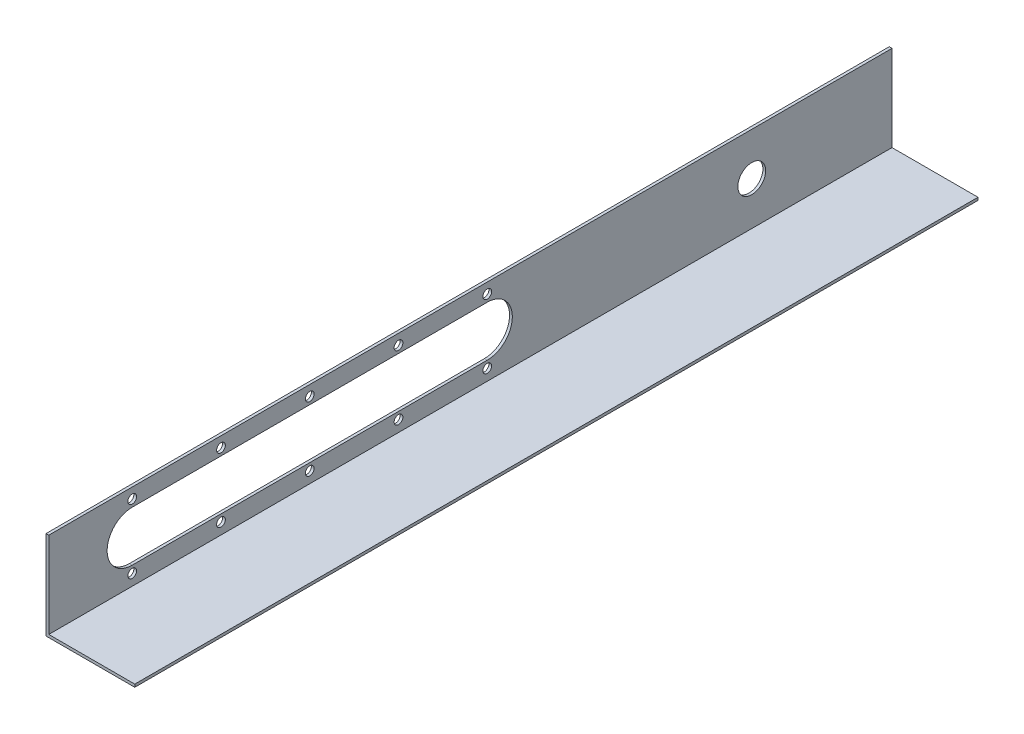
ISO-10303-21;
HEADER;
FILE_DESCRIPTION(('STEP AP214'),'2;1');
FILE_NAME('part.step','',(''),(''),'','','');
FILE_SCHEMA(('AUTOMOTIVE_DESIGN { 1 0 10303 214 1 1 1 1 }'));
ENDSEC;
DATA;
#1=APPLICATION_CONTEXT('core data for automotive mechanical design processes');
#2=APPLICATION_PROTOCOL_DEFINITION('international standard','automotive_design',2000,#1);
#3=PRODUCT_CONTEXT('',#1,'mechanical');
#4=PRODUCT('Part','Part','',(#3));
#5=PRODUCT_RELATED_PRODUCT_CATEGORY('part','',(#4));
#6=PRODUCT_DEFINITION_FORMATION('','',#4);
#7=PRODUCT_DEFINITION_CONTEXT('part definition',#1,'design');
#8=PRODUCT_DEFINITION('design','',#6,#7);
#9=PRODUCT_DEFINITION_SHAPE('','',#8);
#10=(LENGTH_UNIT() NAMED_UNIT(*) SI_UNIT(.MILLI.,.METRE.));
#11=(NAMED_UNIT(*) PLANE_ANGLE_UNIT() SI_UNIT($,.RADIAN.));
#12=(NAMED_UNIT(*) SI_UNIT($,.STERADIAN.) SOLID_ANGLE_UNIT());
#13=UNCERTAINTY_MEASURE_WITH_UNIT(LENGTH_MEASURE(1.E-05),#10,'distance_accuracy_value','');
#14=(GEOMETRIC_REPRESENTATION_CONTEXT(3) GLOBAL_UNCERTAINTY_ASSIGNED_CONTEXT((#13)) GLOBAL_UNIT_ASSIGNED_CONTEXT((#10,
#11,#12)) REPRESENTATION_CONTEXT('',''));
#15=CARTESIAN_POINT('',(0.,0.,0.));
#16=DIRECTION('',(0.,0.,1.));
#17=DIRECTION('',(1.,0.,0.));
#18=AXIS2_PLACEMENT_3D('',#15,#16,#17);
#19=CARTESIAN_POINT('',(0.,0.,482.6));
#20=DIRECTION('',(-1.,0.,0.));
#21=DIRECTION('',(0.,-1.,0.));
#22=AXIS2_PLACEMENT_3D('',#19,#20,#21);
#23=PLANE('',#22);
#24=CARTESIAN_POINT('',(0.,43.2435,434.848));
#25=DIRECTION('',(1.,0.,0.));
#26=DIRECTION('',(0.,0.,-1.));
#27=AXIS2_PLACEMENT_3D('',#24,#25,#26);
#28=CIRCLE('',#27,2.499999953);
#29=CARTESIAN_POINT('',(0.,43.2435,432.348000047));
#30=VERTEX_POINT('',#29);
#31=EDGE_CURVE('E321',#30,#30,#28,.T.);
#32=ORIENTED_EDGE('',*,*,#31,.F.);
#33=EDGE_LOOP('',(#32));
#34=FACE_BOUND('',#33,.T.);
#35=CARTESIAN_POINT('',(0.,43.2435,384.048));
#36=DIRECTION('',(1.,0.,0.));
#37=DIRECTION('',(0.,0.,-1.));
#38=AXIS2_PLACEMENT_3D('',#35,#36,#37);
#39=CIRCLE('',#38,2.499999953);
#40=CARTESIAN_POINT('',(0.,43.2435,381.548000047));
#41=VERTEX_POINT('',#40);
#42=EDGE_CURVE('E317',#41,#41,#39,.T.);
#43=ORIENTED_EDGE('',*,*,#42,.F.);
#44=EDGE_LOOP('',(#43));
#45=FACE_BOUND('',#44,.T.);
#46=CARTESIAN_POINT('',(0.,43.2435,282.448));
#47=DIRECTION('',(1.,0.,0.));
#48=DIRECTION('',(0.,0.,-1.));
#49=AXIS2_PLACEMENT_3D('',#46,#47,#48);
#50=CIRCLE('',#49,2.499999953);
#51=CARTESIAN_POINT('',(0.,43.2435,279.948000047));
#52=VERTEX_POINT('',#51);
#53=EDGE_CURVE('E309',#52,#52,#50,.T.);
#54=ORIENTED_EDGE('',*,*,#53,.F.);
#55=EDGE_LOOP('',(#54));
#56=FACE_BOUND('',#55,.T.);
#57=CARTESIAN_POINT('',(0.,43.2435,231.648));
#58=DIRECTION('',(1.,0.,0.));
#59=DIRECTION('',(0.,0.,-1.));
#60=AXIS2_PLACEMENT_3D('',#57,#58,#59);
#61=CIRCLE('',#60,2.499999953);
#62=CARTESIAN_POINT('',(0.,43.2435,229.148000047));
#63=VERTEX_POINT('',#62);
#64=EDGE_CURVE('E305',#63,#63,#61,.T.);
#65=ORIENTED_EDGE('',*,*,#64,.F.);
#66=EDGE_LOOP('',(#65));
#67=FACE_BOUND('',#66,.T.);
#68=CARTESIAN_POINT('',(0.,6.4135,231.648));
#69=DIRECTION('',(1.,0.,0.));
#70=DIRECTION('',(0.,0.,-1.));
#71=AXIS2_PLACEMENT_3D('',#68,#69,#70);
#72=CIRCLE('',#71,2.499999953);
#73=CARTESIAN_POINT('',(0.,6.4135,229.148000047));
#74=VERTEX_POINT('',#73);
#75=EDGE_CURVE('E301',#74,#74,#72,.T.);
#76=ORIENTED_EDGE('',*,*,#75,.F.);
#77=EDGE_LOOP('',(#76));
#78=FACE_BOUND('',#77,.T.);
#79=CARTESIAN_POINT('',(0.,6.41349999999999,282.448));
#80=DIRECTION('',(1.,0.,0.));
#81=DIRECTION('',(0.,0.,-1.));
#82=AXIS2_PLACEMENT_3D('',#79,#80,#81);
#83=CIRCLE('',#82,2.499999953);
#84=CARTESIAN_POINT('',(0.,6.41349999999999,279.948000047));
#85=VERTEX_POINT('',#84);
#86=EDGE_CURVE('E297',#85,#85,#83,.T.);
#87=ORIENTED_EDGE('',*,*,#86,.F.);
#88=EDGE_LOOP('',(#87));
#89=FACE_BOUND('',#88,.T.);
#90=CARTESIAN_POINT('',(0.,6.41349999999999,384.048));
#91=DIRECTION('',(1.,0.,0.));
#92=DIRECTION('',(0.,0.,-1.));
#93=AXIS2_PLACEMENT_3D('',#90,#91,#92);
#94=CIRCLE('',#93,2.499999953);
#95=CARTESIAN_POINT('',(0.,6.41349999999999,381.548000047));
#96=VERTEX_POINT('',#95);
#97=EDGE_CURVE('E289',#96,#96,#94,.T.);
#98=ORIENTED_EDGE('',*,*,#97,.F.);
#99=EDGE_LOOP('',(#98));
#100=FACE_BOUND('',#99,.T.);
#101=CARTESIAN_POINT('',(0.,6.41349999999999,434.848));
#102=DIRECTION('',(1.,0.,0.));
#103=DIRECTION('',(0.,0.,-1.));
#104=AXIS2_PLACEMENT_3D('',#101,#102,#103);
#105=CIRCLE('',#104,2.499999953);
#106=CARTESIAN_POINT('',(0.,6.41349999999999,432.348000047));
#107=VERTEX_POINT('',#106);
#108=EDGE_CURVE('E285',#107,#107,#105,.T.);
#109=ORIENTED_EDGE('',*,*,#108,.F.);
#110=EDGE_LOOP('',(#109));
#111=FACE_BOUND('',#110,.T.);
#112=CARTESIAN_POINT('',(0.,24.7735948291677,80.264));
#113=DIRECTION('',(1.,0.,0.));
#114=DIRECTION('',(0.,1.,0.));
#115=AXIS2_PLACEMENT_3D('',#112,#113,#114);
#116=CIRCLE('',#115,7.9629);
#117=CARTESIAN_POINT('',(0.,32.7364948291677,80.264));
#118=VERTEX_POINT('',#117);
#119=EDGE_CURVE('E133',#118,#118,#116,.T.);
#120=ORIENTED_EDGE('',*,*,#119,.F.);
#121=EDGE_LOOP('',(#120));
#122=FACE_BOUND('',#121,.T.);
#123=DIRECTION('',(0.,0.,-1.));
#124=VECTOR('',#123,1.);
#125=CARTESIAN_POINT('',(0.,10.4775,434.848));
#126=LINE('',#125,#124);
#127=CARTESIAN_POINT('',(0.,10.4775,434.848));
#128=VERTEX_POINT('',#127);
#129=CARTESIAN_POINT('',(0.,10.4775,231.648));
#130=VERTEX_POINT('',#129);
#131=EDGE_CURVE('E139',#128,#130,#126,.T.);
#132=ORIENTED_EDGE('',*,*,#131,.F.);
#133=CARTESIAN_POINT('',(0.,24.8285,434.848));
#134=DIRECTION('',(1.,0.,0.));
#135=DIRECTION('',(0.,1.,0.));
#136=AXIS2_PLACEMENT_3D('',#133,#134,#135);
#137=CIRCLE('',#136,14.351);
#138=CARTESIAN_POINT('',(0.,39.1795,434.848));
#139=VERTEX_POINT('',#138);
#140=EDGE_CURVE('E47',#139,#128,#137,.T.);
#141=ORIENTED_EDGE('',*,*,#140,.F.);
#142=DIRECTION('',(0.,0.,1.));
#143=VECTOR('',#142,1.);
#144=CARTESIAN_POINT('',(0.,39.1795,434.848));
#145=LINE('',#144,#143);
#146=CARTESIAN_POINT('',(0.,39.1795,231.648));
#147=VERTEX_POINT('',#146);
#148=EDGE_CURVE('E127',#147,#139,#145,.T.);
#149=ORIENTED_EDGE('',*,*,#148,.F.);
#150=CARTESIAN_POINT('',(0.,24.8285,231.648));
#151=DIRECTION('',(1.,0.,0.));
#152=DIRECTION('',(0.,1.,0.));
#153=AXIS2_PLACEMENT_3D('',#150,#151,#152);
#154=CIRCLE('',#153,14.351);
#155=EDGE_CURVE('E130',#130,#147,#154,.T.);
#156=ORIENTED_EDGE('',*,*,#155,.F.);
#157=EDGE_LOOP('',(#132,#141,#149,#156));
#158=FACE_BOUND('',#157,.T.);
#159=DIRECTION('',(0.,1.,0.));
#160=VECTOR('',#159,1.);
#161=CARTESIAN_POINT('',(0.,0.,0.));
#162=LINE('',#161,#160);
#163=CARTESIAN_POINT('',(0.,0.,0.));
#164=VERTEX_POINT('',#163);
#165=CARTESIAN_POINT('',(0.,49.2125,0.));
#166=VERTEX_POINT('',#165);
#167=EDGE_CURVE('E167',#164,#166,#162,.T.);
#168=ORIENTED_EDGE('',*,*,#167,.T.);
#169=DIRECTION('',(0.,0.,-1.));
#170=VECTOR('',#169,1.);
#171=CARTESIAN_POINT('',(0.,49.2125,482.6));
#172=LINE('',#171,#170);
#173=CARTESIAN_POINT('',(0.,49.2125,482.6));
#174=VERTEX_POINT('',#173);
#175=EDGE_CURVE('E40',#174,#166,#172,.T.);
#176=ORIENTED_EDGE('',*,*,#175,.F.);
#177=DIRECTION('',(0.,1.,0.));
#178=VECTOR('',#177,1.);
#179=CARTESIAN_POINT('',(0.,0.,482.6));
#180=LINE('',#179,#178);
#181=CARTESIAN_POINT('',(0.,0.,482.6));
#182=VERTEX_POINT('',#181);
#183=EDGE_CURVE('E153',#182,#174,#180,.T.);
#184=ORIENTED_EDGE('',*,*,#183,.F.);
#185=DIRECTION('',(0.,0.,-1.));
#186=VECTOR('',#185,1.);
#187=CARTESIAN_POINT('',(0.,0.,482.6));
#188=LINE('',#187,#186);
#189=EDGE_CURVE('E11',#182,#164,#188,.T.);
#190=ORIENTED_EDGE('',*,*,#189,.T.);
#191=EDGE_LOOP('',(#168,#176,#184,#190));
#192=FACE_BOUND('',#191,.T.);
#193=CARTESIAN_POINT('',(0.,6.41349999999999,333.248));
#194=DIRECTION('',(1.,0.,0.));
#195=DIRECTION('',(0.,0.,-1.));
#196=AXIS2_PLACEMENT_3D('',#193,#194,#195);
#197=CIRCLE('',#196,2.499999953);
#198=CARTESIAN_POINT('',(0.,6.41349999999999,330.748000047));
#199=VERTEX_POINT('',#198);
#200=EDGE_CURVE('E293',#199,#199,#197,.T.);
#201=ORIENTED_EDGE('',*,*,#200,.F.);
#202=EDGE_LOOP('',(#201));
#203=FACE_BOUND('',#202,.T.);
#204=CARTESIAN_POINT('',(0.,43.2435,333.248));
#205=DIRECTION('',(1.,0.,0.));
#206=DIRECTION('',(0.,0.,-1.));
#207=AXIS2_PLACEMENT_3D('',#204,#205,#206);
#208=CIRCLE('',#207,2.499999953);
#209=CARTESIAN_POINT('',(0.,43.2435,330.748000047));
#210=VERTEX_POINT('',#209);
#211=EDGE_CURVE('E313',#210,#210,#208,.T.);
#212=ORIENTED_EDGE('',*,*,#211,.F.);
#213=EDGE_LOOP('',(#212));
#214=FACE_BOUND('',#213,.T.);
#215=ADVANCED_FACE('F32',(#34,#45,#56,#67,#78,#89,#100,#111,#122,#158,#192,#203,#214),#23,.F.);
#216=CARTESIAN_POINT('',(49.2125,0.,482.6));
#217=DIRECTION('',(0.,-1.,0.));
#218=DIRECTION('',(1.,0.,0.));
#219=AXIS2_PLACEMENT_3D('',#216,#217,#218);
#220=PLANE('',#219);
#221=DIRECTION('',(-1.,0.,0.));
#222=VECTOR('',#221,1.);
#223=CARTESIAN_POINT('',(49.2125,0.,0.));
#224=LINE('',#223,#222);
#225=CARTESIAN_POINT('',(49.2125,0.,0.));
#226=VERTEX_POINT('',#225);
#227=EDGE_CURVE('E146',#226,#164,#224,.T.);
#228=ORIENTED_EDGE('',*,*,#227,.T.);
#229=ORIENTED_EDGE('',*,*,#189,.F.);
#230=DIRECTION('',(-1.,0.,0.));
#231=VECTOR('',#230,1.);
#232=CARTESIAN_POINT('',(49.2125,0.,482.6));
#233=LINE('',#232,#231);
#234=CARTESIAN_POINT('',(49.2125,0.,482.6));
#235=VERTEX_POINT('',#234);
#236=EDGE_CURVE('E150',#235,#182,#233,.T.);
#237=ORIENTED_EDGE('',*,*,#236,.F.);
#238=DIRECTION('',(0.,0.,-1.));
#239=VECTOR('',#238,1.);
#240=CARTESIAN_POINT('',(49.2125,0.,482.6));
#241=LINE('',#240,#239);
#242=EDGE_CURVE('E164',#235,#226,#241,.T.);
#243=ORIENTED_EDGE('',*,*,#242,.T.);
#244=EDGE_LOOP('',(#228,#229,#237,#243));
#245=FACE_BOUND('',#244,.T.);
#246=ADVANCED_FACE('F34',(#245),#220,.F.);
#247=CARTESIAN_POINT('',(0.,49.2125,482.6));
#248=DIRECTION('',(0.,-1.,0.));
#249=DIRECTION('',(1.,0.,0.));
#250=AXIS2_PLACEMENT_3D('',#247,#248,#249);
#251=PLANE('',#250);
#252=DIRECTION('',(-1.,0.,0.));
#253=VECTOR('',#252,1.);
#254=CARTESIAN_POINT('',(0.,49.2125,0.));
#255=LINE('',#254,#253);
#256=CARTESIAN_POINT('',(-1.5875,49.2125,0.));
#257=VERTEX_POINT('',#256);
#258=EDGE_CURVE('E169',#166,#257,#255,.T.);
#259=ORIENTED_EDGE('',*,*,#258,.T.);
#260=DIRECTION('',(0.,0.,-1.));
#261=VECTOR('',#260,1.);
#262=CARTESIAN_POINT('',(-1.5875,49.2125,482.6));
#263=LINE('',#262,#261);
#264=CARTESIAN_POINT('',(-1.5875,49.2125,482.6));
#265=VERTEX_POINT('',#264);
#266=EDGE_CURVE('E184',#265,#257,#263,.T.);
#267=ORIENTED_EDGE('',*,*,#266,.F.);
#268=DIRECTION('',(-1.,0.,0.));
#269=VECTOR('',#268,1.);
#270=CARTESIAN_POINT('',(0.,49.2125,482.6));
#271=LINE('',#270,#269);
#272=EDGE_CURVE('E156',#174,#265,#271,.T.);
#273=ORIENTED_EDGE('',*,*,#272,.F.);
#274=ORIENTED_EDGE('',*,*,#175,.T.);
#275=EDGE_LOOP('',(#259,#267,#273,#274));
#276=FACE_BOUND('',#275,.T.);
#277=ADVANCED_FACE('F191',(#276),#251,.F.);
#278=CARTESIAN_POINT('',(-1.5875,49.2125,482.6));
#279=DIRECTION('',(1.,0.,0.));
#280=DIRECTION('',(0.,1.,0.));
#281=AXIS2_PLACEMENT_3D('',#278,#279,#280);
#282=PLANE('',#281);
#283=CARTESIAN_POINT('',(-1.58750000000001,43.2435,434.848));
#284=DIRECTION('',(1.,0.,0.));
#285=DIRECTION('',(0.,0.,-1.));
#286=AXIS2_PLACEMENT_3D('',#283,#284,#285);
#287=CIRCLE('',#286,2.499999953);
#288=CARTESIAN_POINT('',(-1.58750000000001,43.2435,432.348000047));
#289=VERTEX_POINT('',#288);
#290=EDGE_CURVE('E242',#289,#289,#287,.T.);
#291=ORIENTED_EDGE('',*,*,#290,.T.);
#292=EDGE_LOOP('',(#291));
#293=FACE_BOUND('',#292,.T.);
#294=CARTESIAN_POINT('',(-1.58750000000001,43.2435,384.048));
#295=DIRECTION('',(1.,0.,0.));
#296=DIRECTION('',(0.,0.,-1.));
#297=AXIS2_PLACEMENT_3D('',#294,#295,#296);
#298=CIRCLE('',#297,2.499999953);
#299=CARTESIAN_POINT('',(-1.58750000000001,43.2435,381.548000047));
#300=VERTEX_POINT('',#299);
#301=EDGE_CURVE('E246',#300,#300,#298,.T.);
#302=ORIENTED_EDGE('',*,*,#301,.T.);
#303=EDGE_LOOP('',(#302));
#304=FACE_BOUND('',#303,.T.);
#305=CARTESIAN_POINT('',(-1.58750000000001,43.2435,333.248));
#306=DIRECTION('',(1.,0.,0.));
#307=DIRECTION('',(0.,0.,-1.));
#308=AXIS2_PLACEMENT_3D('',#305,#306,#307);
#309=CIRCLE('',#308,2.499999953);
#310=CARTESIAN_POINT('',(-1.58750000000001,43.2435,330.748000047));
#311=VERTEX_POINT('',#310);
#312=EDGE_CURVE('E250',#311,#311,#309,.T.);
#313=ORIENTED_EDGE('',*,*,#312,.T.);
#314=EDGE_LOOP('',(#313));
#315=FACE_BOUND('',#314,.T.);
#316=CARTESIAN_POINT('',(-1.58750000000001,43.2435,282.448));
#317=DIRECTION('',(1.,0.,0.));
#318=DIRECTION('',(0.,0.,-1.));
#319=AXIS2_PLACEMENT_3D('',#316,#317,#318);
#320=CIRCLE('',#319,2.499999953);
#321=CARTESIAN_POINT('',(-1.58750000000001,43.2435,279.948000047));
#322=VERTEX_POINT('',#321);
#323=EDGE_CURVE('E254',#322,#322,#320,.T.);
#324=ORIENTED_EDGE('',*,*,#323,.T.);
#325=EDGE_LOOP('',(#324));
#326=FACE_BOUND('',#325,.T.);
#327=CARTESIAN_POINT('',(-1.58750000000001,43.2435,231.648));
#328=DIRECTION('',(1.,0.,0.));
#329=DIRECTION('',(0.,0.,-1.));
#330=AXIS2_PLACEMENT_3D('',#327,#328,#329);
#331=CIRCLE('',#330,2.499999953);
#332=CARTESIAN_POINT('',(-1.58750000000001,43.2435,229.148000047));
#333=VERTEX_POINT('',#332);
#334=EDGE_CURVE('E258',#333,#333,#331,.T.);
#335=ORIENTED_EDGE('',*,*,#334,.T.);
#336=EDGE_LOOP('',(#335));
#337=FACE_BOUND('',#336,.T.);
#338=CARTESIAN_POINT('',(-1.58750000000001,6.4135,231.648));
#339=DIRECTION('',(1.,0.,0.));
#340=DIRECTION('',(0.,0.,-1.));
#341=AXIS2_PLACEMENT_3D('',#338,#339,#340);
#342=CIRCLE('',#341,2.499999953);
#343=CARTESIAN_POINT('',(-1.58750000000001,6.4135,229.148000047));
#344=VERTEX_POINT('',#343);
#345=EDGE_CURVE('E262',#344,#344,#342,.T.);
#346=ORIENTED_EDGE('',*,*,#345,.T.);
#347=EDGE_LOOP('',(#346));
#348=FACE_BOUND('',#347,.T.);
#349=CARTESIAN_POINT('',(-1.58750000000001,6.41349999999999,282.448));
#350=DIRECTION('',(1.,0.,0.));
#351=DIRECTION('',(0.,0.,-1.));
#352=AXIS2_PLACEMENT_3D('',#349,#350,#351);
#353=CIRCLE('',#352,2.499999953);
#354=CARTESIAN_POINT('',(-1.58750000000001,6.41349999999999,279.948000047));
#355=VERTEX_POINT('',#354);
#356=EDGE_CURVE('E266',#355,#355,#353,.T.);
#357=ORIENTED_EDGE('',*,*,#356,.T.);
#358=EDGE_LOOP('',(#357));
#359=FACE_BOUND('',#358,.T.);
#360=CARTESIAN_POINT('',(-1.58750000000001,6.41349999999999,333.248));
#361=DIRECTION('',(1.,0.,0.));
#362=DIRECTION('',(0.,0.,-1.));
#363=AXIS2_PLACEMENT_3D('',#360,#361,#362);
#364=CIRCLE('',#363,2.499999953);
#365=CARTESIAN_POINT('',(-1.58750000000001,6.41349999999999,330.748000047));
#366=VERTEX_POINT('',#365);
#367=EDGE_CURVE('E270',#366,#366,#364,.T.);
#368=ORIENTED_EDGE('',*,*,#367,.T.);
#369=EDGE_LOOP('',(#368));
#370=FACE_BOUND('',#369,.T.);
#371=CARTESIAN_POINT('',(-1.58750000000001,6.41349999999999,384.048));
#372=DIRECTION('',(1.,0.,0.));
#373=DIRECTION('',(0.,0.,-1.));
#374=AXIS2_PLACEMENT_3D('',#371,#372,#373);
#375=CIRCLE('',#374,2.499999953);
#376=CARTESIAN_POINT('',(-1.58750000000001,6.41349999999999,381.548000047));
#377=VERTEX_POINT('',#376);
#378=EDGE_CURVE('E274',#377,#377,#375,.T.);
#379=ORIENTED_EDGE('',*,*,#378,.T.);
#380=EDGE_LOOP('',(#379));
#381=FACE_BOUND('',#380,.T.);
#382=CARTESIAN_POINT('',(-1.58750000000001,6.41349999999999,434.848));
#383=DIRECTION('',(1.,0.,0.));
#384=DIRECTION('',(0.,0.,-1.));
#385=AXIS2_PLACEMENT_3D('',#382,#383,#384);
#386=CIRCLE('',#385,2.499999953);
#387=CARTESIAN_POINT('',(-1.58750000000001,6.41349999999999,432.348000047));
#388=VERTEX_POINT('',#387);
#389=EDGE_CURVE('E278',#388,#388,#386,.T.);
#390=ORIENTED_EDGE('',*,*,#389,.T.);
#391=EDGE_LOOP('',(#390));
#392=FACE_BOUND('',#391,.T.);
#393=CARTESIAN_POINT('',(-1.58750000000001,24.7735948291677,80.264));
#394=DIRECTION('',(1.,0.,0.));
#395=DIRECTION('',(0.,1.,0.));
#396=AXIS2_PLACEMENT_3D('',#393,#394,#395);
#397=CIRCLE('',#396,7.9629);
#398=CARTESIAN_POINT('',(-1.58750000000001,32.7364948291677,80.264));
#399=VERTEX_POINT('',#398);
#400=EDGE_CURVE('E140',#399,#399,#397,.T.);
#401=ORIENTED_EDGE('',*,*,#400,.T.);
#402=EDGE_LOOP('',(#401));
#403=FACE_BOUND('',#402,.T.);
#404=DIRECTION('',(0.,0.,1.));
#405=VECTOR('',#404,1.);
#406=CARTESIAN_POINT('',(-1.58750000000001,39.1795,434.848));
#407=LINE('',#406,#405);
#408=CARTESIAN_POINT('',(-1.58750000000001,39.1795,231.648));
#409=VERTEX_POINT('',#408);
#410=CARTESIAN_POINT('',(-1.58750000000001,39.1795,434.848));
#411=VERTEX_POINT('',#410);
#412=EDGE_CURVE('E117',#409,#411,#407,.T.);
#413=ORIENTED_EDGE('',*,*,#412,.T.);
#414=CARTESIAN_POINT('',(-1.58750000000001,24.8285,434.848));
#415=DIRECTION('',(1.,0.,0.));
#416=DIRECTION('',(0.,1.,0.));
#417=AXIS2_PLACEMENT_3D('',#414,#415,#416);
#418=CIRCLE('',#417,14.351);
#419=CARTESIAN_POINT('',(-1.58750000000001,10.4775,434.848));
#420=VERTEX_POINT('',#419);
#421=EDGE_CURVE('E111',#411,#420,#418,.T.);
#422=ORIENTED_EDGE('',*,*,#421,.T.);
#423=DIRECTION('',(0.,0.,-1.));
#424=VECTOR('',#423,1.);
#425=CARTESIAN_POINT('',(-1.58750000000001,10.4775,434.848));
#426=LINE('',#425,#424);
#427=CARTESIAN_POINT('',(-1.5875,10.4775,231.648));
#428=VERTEX_POINT('',#427);
#429=EDGE_CURVE('E120',#420,#428,#426,.T.);
#430=ORIENTED_EDGE('',*,*,#429,.T.);
#431=CARTESIAN_POINT('',(-1.58750000000001,24.8285,231.648));
#432=DIRECTION('',(1.,0.,0.));
#433=DIRECTION('',(0.,1.,0.));
#434=AXIS2_PLACEMENT_3D('',#431,#432,#433);
#435=CIRCLE('',#434,14.351);
#436=EDGE_CURVE('E55',#428,#409,#435,.T.);
#437=ORIENTED_EDGE('',*,*,#436,.T.);
#438=EDGE_LOOP('',(#413,#422,#430,#437));
#439=FACE_BOUND('',#438,.T.);
#440=DIRECTION('',(0.,-1.,0.));
#441=VECTOR('',#440,1.);
#442=CARTESIAN_POINT('',(-1.5875,49.2125,0.));
#443=LINE('',#442,#441);
#444=CARTESIAN_POINT('',(-1.58750000000001,-1.5875,0.));
#445=VERTEX_POINT('',#444);
#446=EDGE_CURVE('E171',#257,#445,#443,.T.);
#447=ORIENTED_EDGE('',*,*,#446,.T.);
#448=DIRECTION('',(0.,0.,-1.));
#449=VECTOR('',#448,1.);
#450=CARTESIAN_POINT('',(-1.58750000000001,-1.5875,482.6));
#451=LINE('',#450,#449);
#452=CARTESIAN_POINT('',(-1.58750000000001,-1.5875,482.6));
#453=VERTEX_POINT('',#452);
#454=EDGE_CURVE('E181',#453,#445,#451,.T.);
#455=ORIENTED_EDGE('',*,*,#454,.F.);
#456=DIRECTION('',(0.,-1.,0.));
#457=VECTOR('',#456,1.);
#458=CARTESIAN_POINT('',(-1.5875,49.2125,482.6));
#459=LINE('',#458,#457);
#460=EDGE_CURVE('E158',#265,#453,#459,.T.);
#461=ORIENTED_EDGE('',*,*,#460,.F.);
#462=ORIENTED_EDGE('',*,*,#266,.T.);
#463=EDGE_LOOP('',(#447,#455,#461,#462));
#464=FACE_BOUND('',#463,.T.);
#465=ADVANCED_FACE('F124',(#293,#304,#315,#326,#337,#348,#359,#370,#381,#392,#403,#439,#464),
#282,.F.);
#466=CARTESIAN_POINT('',(-1.58750000000001,-1.5875,482.6));
#467=DIRECTION('',(0.,1.,0.));
#468=DIRECTION('',(-1.,0.,0.));
#469=AXIS2_PLACEMENT_3D('',#466,#467,#468);
#470=PLANE('',#469);
#471=DIRECTION('',(1.,0.,0.));
#472=VECTOR('',#471,1.);
#473=CARTESIAN_POINT('',(-1.58750000000001,-1.5875,0.));
#474=LINE('',#473,#472);
#475=CARTESIAN_POINT('',(49.2125,-1.58749999999999,0.));
#476=VERTEX_POINT('',#475);
#477=EDGE_CURVE('E173',#445,#476,#474,.T.);
#478=ORIENTED_EDGE('',*,*,#477,.T.);
#479=DIRECTION('',(0.,0.,-1.));
#480=VECTOR('',#479,1.);
#481=CARTESIAN_POINT('',(49.2125,-1.58749999999999,482.6));
#482=LINE('',#481,#480);
#483=CARTESIAN_POINT('',(49.2125,-1.58749999999999,482.6));
#484=VERTEX_POINT('',#483);
#485=EDGE_CURVE('E178',#484,#476,#482,.T.);
#486=ORIENTED_EDGE('',*,*,#485,.F.);
#487=DIRECTION('',(1.,0.,0.));
#488=VECTOR('',#487,1.);
#489=CARTESIAN_POINT('',(-1.58750000000001,-1.5875,482.6));
#490=LINE('',#489,#488);
#491=EDGE_CURVE('E160',#453,#484,#490,.T.);
#492=ORIENTED_EDGE('',*,*,#491,.F.);
#493=ORIENTED_EDGE('',*,*,#454,.T.);
#494=EDGE_LOOP('',(#478,#486,#492,#493));
#495=FACE_BOUND('',#494,.T.);
#496=ADVANCED_FACE('F204',(#495),#470,.F.);
#497=CARTESIAN_POINT('',(49.2125,-1.58749999999999,482.6));
#498=DIRECTION('',(-1.,0.,0.));
#499=DIRECTION('',(0.,-1.,0.));
#500=AXIS2_PLACEMENT_3D('',#497,#498,#499);
#501=PLANE('',#500);
#502=DIRECTION('',(0.,1.,0.));
#503=VECTOR('',#502,1.);
#504=CARTESIAN_POINT('',(49.2125,-1.58749999999999,0.));
#505=LINE('',#504,#503);
#506=EDGE_CURVE('E154',#476,#226,#505,.T.);
#507=ORIENTED_EDGE('',*,*,#506,.T.);
#508=ORIENTED_EDGE('',*,*,#242,.F.);
#509=DIRECTION('',(0.,1.,0.));
#510=VECTOR('',#509,1.);
#511=CARTESIAN_POINT('',(49.2125,-1.58749999999999,482.6));
#512=LINE('',#511,#510);
#513=EDGE_CURVE('E162',#484,#235,#512,.T.);
#514=ORIENTED_EDGE('',*,*,#513,.F.);
#515=ORIENTED_EDGE('',*,*,#485,.T.);
#516=EDGE_LOOP('',(#507,#508,#514,#515));
#517=FACE_BOUND('',#516,.T.);
#518=ADVANCED_FACE('F215',(#517),#501,.F.);
#519=CARTESIAN_POINT('',(0.,0.,482.6));
#520=DIRECTION('',(0.,0.,-1.));
#521=DIRECTION('',(-1.,0.,0.));
#522=AXIS2_PLACEMENT_3D('',#519,#520,#521);
#523=PLANE('',#522);
#524=ORIENTED_EDGE('',*,*,#236,.T.);
#525=ORIENTED_EDGE('',*,*,#183,.T.);
#526=ORIENTED_EDGE('',*,*,#272,.T.);
#527=ORIENTED_EDGE('',*,*,#460,.T.);
#528=ORIENTED_EDGE('',*,*,#491,.T.);
#529=ORIENTED_EDGE('',*,*,#513,.T.);
#530=EDGE_LOOP('',(#524,#525,#526,#527,#528,#529));
#531=FACE_BOUND('',#530,.T.);
#532=ADVANCED_FACE('F208',(#531),#523,.F.);
#533=CARTESIAN_POINT('',(0.,0.,0.));
#534=DIRECTION('',(0.,0.,-1.));
#535=DIRECTION('',(-1.,0.,0.));
#536=AXIS2_PLACEMENT_3D('',#533,#534,#535);
#537=PLANE('',#536);
#538=ORIENTED_EDGE('',*,*,#227,.F.);
#539=ORIENTED_EDGE('',*,*,#506,.F.);
#540=ORIENTED_EDGE('',*,*,#477,.F.);
#541=ORIENTED_EDGE('',*,*,#446,.F.);
#542=ORIENTED_EDGE('',*,*,#258,.F.);
#543=ORIENTED_EDGE('',*,*,#167,.F.);
#544=EDGE_LOOP('',(#538,#539,#540,#541,#542,#543));
#545=FACE_BOUND('',#544,.T.);
#546=ADVANCED_FACE('F197',(#545),#537,.T.);
#547=CARTESIAN_POINT('',(-1.58750000000001,24.8285,434.848));
#548=DIRECTION('',(1.,0.,0.));
#549=DIRECTION('',(0.,1.,0.));
#550=AXIS2_PLACEMENT_3D('',#547,#548,#549);
#551=CYLINDRICAL_SURFACE('',#550,14.351);
#552=ORIENTED_EDGE('',*,*,#140,.T.);
#553=DIRECTION('',(1.,0.,0.));
#554=VECTOR('',#553,1.);
#555=CARTESIAN_POINT('',(-1.58750000000001,10.4775,434.848));
#556=LINE('',#555,#554);
#557=EDGE_CURVE('E107',#420,#128,#556,.T.);
#558=ORIENTED_EDGE('',*,*,#557,.F.);
#559=ORIENTED_EDGE('',*,*,#421,.F.);
#560=DIRECTION('',(1.,0.,0.));
#561=VECTOR('',#560,1.);
#562=CARTESIAN_POINT('',(-1.58750000000001,39.1795,434.848));
#563=LINE('',#562,#561);
#564=EDGE_CURVE('E144',#411,#139,#563,.T.);
#565=ORIENTED_EDGE('',*,*,#564,.T.);
#566=EDGE_LOOP('',(#552,#558,#559,#565));
#567=FACE_BOUND('',#566,.T.);
#568=ADVANCED_FACE('F109',(#567),#551,.F.);
#569=CARTESIAN_POINT('',(-1.58750000000001,39.1795,434.848));
#570=DIRECTION('',(0.,1.,0.));
#571=DIRECTION('',(-1.,0.,0.));
#572=AXIS2_PLACEMENT_3D('',#569,#570,#571);
#573=PLANE('',#572);
#574=ORIENTED_EDGE('',*,*,#148,.T.);
#575=ORIENTED_EDGE('',*,*,#564,.F.);
#576=ORIENTED_EDGE('',*,*,#412,.F.);
#577=DIRECTION('',(1.,0.,0.));
#578=VECTOR('',#577,1.);
#579=CARTESIAN_POINT('',(-1.58750000000001,39.1795,231.648));
#580=LINE('',#579,#578);
#581=EDGE_CURVE('E147',#409,#147,#580,.T.);
#582=ORIENTED_EDGE('',*,*,#581,.T.);
#583=EDGE_LOOP('',(#574,#575,#576,#582));
#584=FACE_BOUND('',#583,.T.);
#585=ADVANCED_FACE('F370',(#584),#573,.F.);
#586=CARTESIAN_POINT('',(-1.58750000000001,24.8285,231.648));
#587=DIRECTION('',(1.,0.,0.));
#588=DIRECTION('',(0.,1.,0.));
#589=AXIS2_PLACEMENT_3D('',#586,#587,#588);
#590=CYLINDRICAL_SURFACE('',#589,14.351);
#591=ORIENTED_EDGE('',*,*,#155,.T.);
#592=ORIENTED_EDGE('',*,*,#581,.F.);
#593=ORIENTED_EDGE('',*,*,#436,.F.);
#594=DIRECTION('',(1.,0.,0.));
#595=VECTOR('',#594,1.);
#596=CARTESIAN_POINT('',(-1.58750000000001,10.4775,231.648));
#597=LINE('',#596,#595);
#598=EDGE_CURVE('E116',#428,#130,#597,.T.);
#599=ORIENTED_EDGE('',*,*,#598,.T.);
#600=EDGE_LOOP('',(#591,#592,#593,#599));
#601=FACE_BOUND('',#600,.T.);
#602=ADVANCED_FACE('F373',(#601),#590,.F.);
#603=CARTESIAN_POINT('',(-1.58750000000001,10.4775,434.848));
#604=DIRECTION('',(0.,-1.,0.));
#605=DIRECTION('',(1.,0.,0.));
#606=AXIS2_PLACEMENT_3D('',#603,#604,#605);
#607=PLANE('',#606);
#608=ORIENTED_EDGE('',*,*,#131,.T.);
#609=ORIENTED_EDGE('',*,*,#598,.F.);
#610=ORIENTED_EDGE('',*,*,#429,.F.);
#611=ORIENTED_EDGE('',*,*,#557,.T.);
#612=EDGE_LOOP('',(#608,#609,#610,#611));
#613=FACE_BOUND('',#612,.T.);
#614=ADVANCED_FACE('F121',(#613),#607,.F.);
#615=CARTESIAN_POINT('',(-1.58750000000001,24.7735948291677,80.264));
#616=DIRECTION('',(1.,0.,0.));
#617=DIRECTION('',(0.,1.,0.));
#618=AXIS2_PLACEMENT_3D('',#615,#616,#617);
#619=CYLINDRICAL_SURFACE('',#618,7.9629);
#620=ORIENTED_EDGE('',*,*,#400,.F.);
#621=EDGE_LOOP('',(#620));
#622=FACE_BOUND('',#621,.T.);
#623=ORIENTED_EDGE('',*,*,#119,.T.);
#624=EDGE_LOOP('',(#623));
#625=FACE_BOUND('',#624,.T.);
#626=ADVANCED_FACE('F366',(#622,#625),#619,.F.);
#627=CARTESIAN_POINT('',(0.,6.41349999999999,434.848));
#628=DIRECTION('',(1.,0.,0.));
#629=DIRECTION('',(0.,0.,-1.));
#630=AXIS2_PLACEMENT_3D('',#627,#628,#629);
#631=CYLINDRICAL_SURFACE('',#630,2.499999953);
#632=ORIENTED_EDGE('',*,*,#389,.F.);
#633=EDGE_LOOP('',(#632));
#634=FACE_BOUND('',#633,.T.);
#635=ORIENTED_EDGE('',*,*,#108,.T.);
#636=EDGE_LOOP('',(#635));
#637=FACE_BOUND('',#636,.T.);
#638=ADVANCED_FACE('F362',(#634,#637),#631,.F.);
#639=CARTESIAN_POINT('',(0.,6.41349999999999,384.048));
#640=DIRECTION('',(1.,0.,0.));
#641=DIRECTION('',(0.,0.,-1.));
#642=AXIS2_PLACEMENT_3D('',#639,#640,#641);
#643=CYLINDRICAL_SURFACE('',#642,2.499999953);
#644=ORIENTED_EDGE('',*,*,#378,.F.);
#645=EDGE_LOOP('',(#644));
#646=FACE_BOUND('',#645,.T.);
#647=ORIENTED_EDGE('',*,*,#97,.T.);
#648=EDGE_LOOP('',(#647));
#649=FACE_BOUND('',#648,.T.);
#650=ADVANCED_FACE('F358',(#646,#649),#643,.F.);
#651=CARTESIAN_POINT('',(0.,6.41349999999999,333.248));
#652=DIRECTION('',(1.,0.,0.));
#653=DIRECTION('',(0.,0.,-1.));
#654=AXIS2_PLACEMENT_3D('',#651,#652,#653);
#655=CYLINDRICAL_SURFACE('',#654,2.499999953);
#656=ORIENTED_EDGE('',*,*,#367,.F.);
#657=EDGE_LOOP('',(#656));
#658=FACE_BOUND('',#657,.T.);
#659=ORIENTED_EDGE('',*,*,#200,.T.);
#660=EDGE_LOOP('',(#659));
#661=FACE_BOUND('',#660,.T.);
#662=ADVANCED_FACE('F354',(#658,#661),#655,.F.);
#663=CARTESIAN_POINT('',(0.,6.41349999999999,282.448));
#664=DIRECTION('',(1.,0.,0.));
#665=DIRECTION('',(0.,0.,-1.));
#666=AXIS2_PLACEMENT_3D('',#663,#664,#665);
#667=CYLINDRICAL_SURFACE('',#666,2.499999953);
#668=ORIENTED_EDGE('',*,*,#356,.F.);
#669=EDGE_LOOP('',(#668));
#670=FACE_BOUND('',#669,.T.);
#671=ORIENTED_EDGE('',*,*,#86,.T.);
#672=EDGE_LOOP('',(#671));
#673=FACE_BOUND('',#672,.T.);
#674=ADVANCED_FACE('F350',(#670,#673),#667,.F.);
#675=CARTESIAN_POINT('',(0.,6.4135,231.648));
#676=DIRECTION('',(1.,0.,0.));
#677=DIRECTION('',(0.,0.,-1.));
#678=AXIS2_PLACEMENT_3D('',#675,#676,#677);
#679=CYLINDRICAL_SURFACE('',#678,2.499999953);
#680=ORIENTED_EDGE('',*,*,#345,.F.);
#681=EDGE_LOOP('',(#680));
#682=FACE_BOUND('',#681,.T.);
#683=ORIENTED_EDGE('',*,*,#75,.T.);
#684=EDGE_LOOP('',(#683));
#685=FACE_BOUND('',#684,.T.);
#686=ADVANCED_FACE('F346',(#682,#685),#679,.F.);
#687=CARTESIAN_POINT('',(0.,43.2435,231.648));
#688=DIRECTION('',(1.,0.,0.));
#689=DIRECTION('',(0.,0.,-1.));
#690=AXIS2_PLACEMENT_3D('',#687,#688,#689);
#691=CYLINDRICAL_SURFACE('',#690,2.499999953);
#692=ORIENTED_EDGE('',*,*,#334,.F.);
#693=EDGE_LOOP('',(#692));
#694=FACE_BOUND('',#693,.T.);
#695=ORIENTED_EDGE('',*,*,#64,.T.);
#696=EDGE_LOOP('',(#695));
#697=FACE_BOUND('',#696,.T.);
#698=ADVANCED_FACE('F342',(#694,#697),#691,.F.);
#699=CARTESIAN_POINT('',(0.,43.2435,282.448));
#700=DIRECTION('',(1.,0.,0.));
#701=DIRECTION('',(0.,0.,-1.));
#702=AXIS2_PLACEMENT_3D('',#699,#700,#701);
#703=CYLINDRICAL_SURFACE('',#702,2.499999953);
#704=ORIENTED_EDGE('',*,*,#323,.F.);
#705=EDGE_LOOP('',(#704));
#706=FACE_BOUND('',#705,.T.);
#707=ORIENTED_EDGE('',*,*,#53,.T.);
#708=EDGE_LOOP('',(#707));
#709=FACE_BOUND('',#708,.T.);
#710=ADVANCED_FACE('F338',(#706,#709),#703,.F.);
#711=CARTESIAN_POINT('',(0.,43.2435,333.248));
#712=DIRECTION('',(1.,0.,0.));
#713=DIRECTION('',(0.,0.,-1.));
#714=AXIS2_PLACEMENT_3D('',#711,#712,#713);
#715=CYLINDRICAL_SURFACE('',#714,2.499999953);
#716=ORIENTED_EDGE('',*,*,#312,.F.);
#717=EDGE_LOOP('',(#716));
#718=FACE_BOUND('',#717,.T.);
#719=ORIENTED_EDGE('',*,*,#211,.T.);
#720=EDGE_LOOP('',(#719));
#721=FACE_BOUND('',#720,.T.);
#722=ADVANCED_FACE('F332',(#718,#721),#715,.F.);
#723=CARTESIAN_POINT('',(0.,43.2435,384.048));
#724=DIRECTION('',(1.,0.,0.));
#725=DIRECTION('',(0.,0.,-1.));
#726=AXIS2_PLACEMENT_3D('',#723,#724,#725);
#727=CYLINDRICAL_SURFACE('',#726,2.499999953);
#728=ORIENTED_EDGE('',*,*,#301,.F.);
#729=EDGE_LOOP('',(#728));
#730=FACE_BOUND('',#729,.T.);
#731=ORIENTED_EDGE('',*,*,#42,.T.);
#732=EDGE_LOOP('',(#731));
#733=FACE_BOUND('',#732,.T.);
#734=ADVANCED_FACE('F326',(#730,#733),#727,.F.);
#735=CARTESIAN_POINT('',(0.,43.2435,434.848));
#736=DIRECTION('',(1.,0.,0.));
#737=DIRECTION('',(0.,0.,-1.));
#738=AXIS2_PLACEMENT_3D('',#735,#736,#737);
#739=CYLINDRICAL_SURFACE('',#738,2.499999953);
#740=ORIENTED_EDGE('',*,*,#290,.F.);
#741=EDGE_LOOP('',(#740));
#742=FACE_BOUND('',#741,.T.);
#743=ORIENTED_EDGE('',*,*,#31,.T.);
#744=EDGE_LOOP('',(#743));
#745=FACE_BOUND('',#744,.T.);
#746=ADVANCED_FACE('F324',(#742,#745),#739,.F.);
#747=CLOSED_SHELL('',(#215,#246,#277,#465,#496,#518,#532,#546,#568,#585,#602,#614,#626,#638,
#650,#662,#674,#686,#698,#710,#722,#734,#746));
#748=MANIFOLD_SOLID_BREP('B2',#747);
#749=ADVANCED_BREP_SHAPE_REPRESENTATION('',(#18,#748),#14);
#750=SHAPE_DEFINITION_REPRESENTATION(#9,#749);
ENDSEC;
END-ISO-10303-21;
